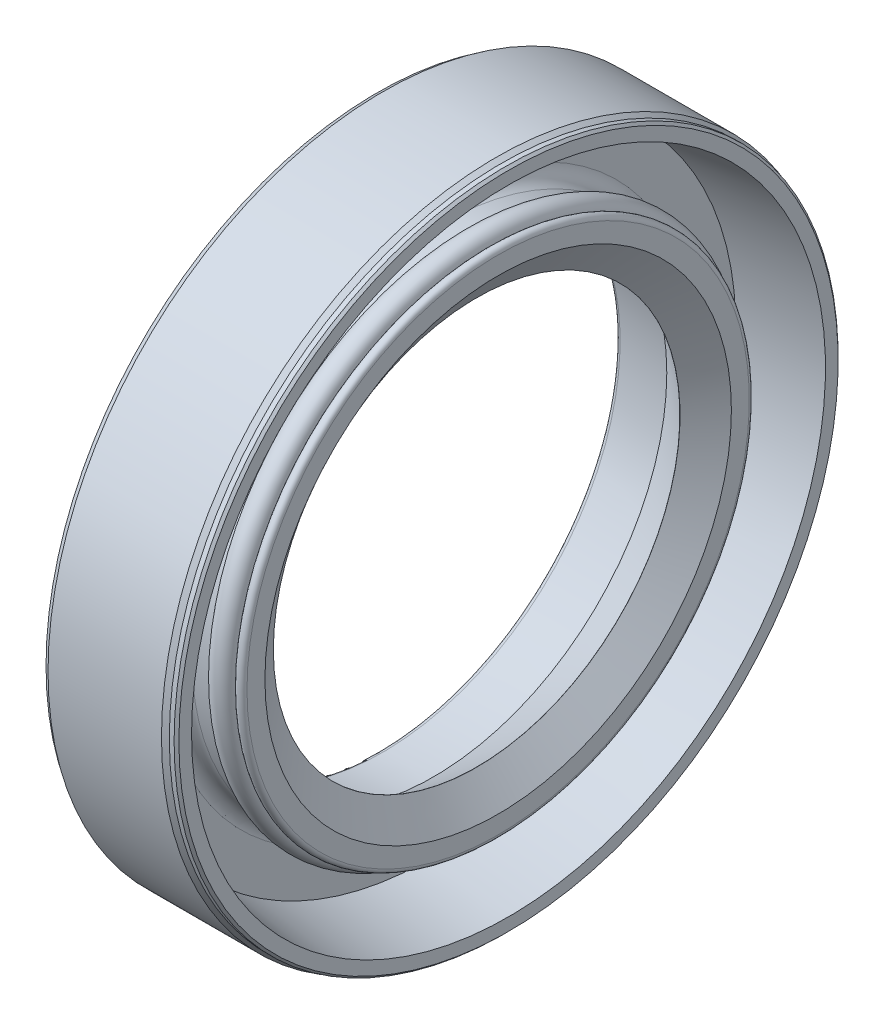
ISO-10303-21;
HEADER;
FILE_DESCRIPTION(('STEP AP214'),'2;1');
FILE_NAME('part.step','',(''),(''),'','','');
FILE_SCHEMA(('AUTOMOTIVE_DESIGN { 1 0 10303 214 1 1 1 1 }'));
ENDSEC;
DATA;
#1=APPLICATION_CONTEXT('core data for automotive mechanical design processes');
#2=APPLICATION_PROTOCOL_DEFINITION('international standard','automotive_design',2000,#1);
#3=PRODUCT_CONTEXT('',#1,'mechanical');
#4=PRODUCT('Part','Part','',(#3));
#5=PRODUCT_RELATED_PRODUCT_CATEGORY('part','',(#4));
#6=PRODUCT_DEFINITION_FORMATION('','',#4);
#7=PRODUCT_DEFINITION_CONTEXT('part definition',#1,'design');
#8=PRODUCT_DEFINITION('design','',#6,#7);
#9=PRODUCT_DEFINITION_SHAPE('','',#8);
#10=(LENGTH_UNIT() NAMED_UNIT(*) SI_UNIT(.MILLI.,.METRE.));
#11=(NAMED_UNIT(*) PLANE_ANGLE_UNIT() SI_UNIT($,.RADIAN.));
#12=(NAMED_UNIT(*) SI_UNIT($,.STERADIAN.) SOLID_ANGLE_UNIT());
#13=UNCERTAINTY_MEASURE_WITH_UNIT(LENGTH_MEASURE(1.E-05),#10,'distance_accuracy_value','');
#14=(GEOMETRIC_REPRESENTATION_CONTEXT(3) GLOBAL_UNCERTAINTY_ASSIGNED_CONTEXT((#13)) GLOBAL_UNIT_ASSIGNED_CONTEXT((#10,
#11,#12)) REPRESENTATION_CONTEXT('',''));
#15=CARTESIAN_POINT('',(0.,0.,0.));
#16=DIRECTION('',(0.,0.,1.));
#17=DIRECTION('',(1.,0.,0.));
#18=AXIS2_PLACEMENT_3D('',#15,#16,#17);
#19=CARTESIAN_POINT('',(0.0025000000000025,0.,0.));
#20=DIRECTION('',(-1.,0.,0.));
#21=DIRECTION('',(0.,0.,1.));
#22=AXIS2_PLACEMENT_3D('',#19,#20,#21);
#23=TOROIDAL_SURFACE('',#22,10.5,0.500000000000002);
#24=CARTESIAN_POINT('',(-0.497500000000001,0.,0.));
#25=DIRECTION('',(-1.,0.,0.));
#26=DIRECTION('',(0.,0.,1.));
#27=AXIS2_PLACEMENT_3D('',#24,#25,#26);
#28=CIRCLE('',#27,10.5);
#29=CARTESIAN_POINT('',(-0.497500000000001,0.,10.5));
#30=VERTEX_POINT('',#29);
#31=EDGE_CURVE('E10',#30,#30,#28,.T.);
#32=ORIENTED_EDGE('',*,*,#31,.F.);
#33=EDGE_LOOP('',(#32));
#34=FACE_BOUND('',#33,.T.);
#35=CARTESIAN_POINT('',(0.502500000000003,0.,0.));
#36=DIRECTION('',(-1.,0.,0.));
#37=DIRECTION('',(0.,0.,1.));
#38=AXIS2_PLACEMENT_3D('',#35,#36,#37);
#39=CIRCLE('',#38,10.5);
#40=CARTESIAN_POINT('',(0.502500000000003,0.,10.5));
#41=VERTEX_POINT('',#40);
#42=EDGE_CURVE('E106',#41,#41,#39,.T.);
#43=ORIENTED_EDGE('',*,*,#42,.T.);
#44=EDGE_LOOP('',(#43));
#45=FACE_BOUND('',#44,.T.);
#46=ADVANCED_FACE('F45',(#34,#45),#23,.T.);
#47=CARTESIAN_POINT('',(0.,0.,0.));
#48=DIRECTION('',(-1.,0.,0.));
#49=DIRECTION('',(0.,0.,1.));
#50=AXIS2_PLACEMENT_3D('',#47,#48,#49);
#51=CYLINDRICAL_SURFACE('',#50,10.5);
#52=CARTESIAN_POINT('',(-1.3975,0.,0.));
#53=DIRECTION('',(-1.,0.,0.));
#54=DIRECTION('',(0.,0.,1.));
#55=AXIS2_PLACEMENT_3D('',#52,#53,#54);
#56=CIRCLE('',#55,10.5);
#57=CARTESIAN_POINT('',(-1.3975,0.,10.5));
#58=VERTEX_POINT('',#57);
#59=EDGE_CURVE('E51',#58,#58,#56,.T.);
#60=ORIENTED_EDGE('',*,*,#59,.F.);
#61=EDGE_LOOP('',(#60));
#62=FACE_BOUND('',#61,.T.);
#63=ORIENTED_EDGE('',*,*,#31,.T.);
#64=EDGE_LOOP('',(#63));
#65=FACE_BOUND('',#64,.T.);
#66=ADVANCED_FACE('F209',(#62,#65),#51,.T.);
#67=CARTESIAN_POINT('',(-1.3975,0.,0.));
#68=DIRECTION('',(-1.,0.,0.));
#69=DIRECTION('',(0.,0.,1.));
#70=AXIS2_PLACEMENT_3D('',#67,#68,#69);
#71=TOROIDAL_SURFACE('',#70,11.1,0.600000000000002);
#72=CARTESIAN_POINT('',(-1.9975,0.,0.));
#73=DIRECTION('',(-1.,0.,0.));
#74=DIRECTION('',(0.,0.,1.));
#75=AXIS2_PLACEMENT_3D('',#72,#73,#74);
#76=CIRCLE('',#75,11.1);
#77=CARTESIAN_POINT('',(-1.9975,0.,11.1));
#78=VERTEX_POINT('',#77);
#79=EDGE_CURVE('E55',#78,#78,#76,.T.);
#80=ORIENTED_EDGE('',*,*,#79,.F.);
#81=EDGE_LOOP('',(#80));
#82=FACE_BOUND('',#81,.T.);
#83=ORIENTED_EDGE('',*,*,#59,.T.);
#84=EDGE_LOOP('',(#83));
#85=FACE_BOUND('',#84,.T.);
#86=ADVANCED_FACE('F204',(#82,#85),#71,.F.);
#87=CARTESIAN_POINT('',(-1.9975,12.8333333333333,0.));
#88=DIRECTION('',(-1.,0.,0.));
#89=DIRECTION('',(0.,0.,1.));
#90=AXIS2_PLACEMENT_3D('',#87,#88,#89);
#91=PLANE('',#90);
#92=CARTESIAN_POINT('',(-1.9975,0.,0.));
#93=DIRECTION('',(-1.,0.,0.));
#94=DIRECTION('',(0.,0.,1.));
#95=AXIS2_PLACEMENT_3D('',#92,#93,#94);
#96=CIRCLE('',#95,12.8333333333333);
#97=CARTESIAN_POINT('',(-1.9975,0.,12.8333333333333));
#98=VERTEX_POINT('',#97);
#99=EDGE_CURVE('E59',#98,#98,#96,.T.);
#100=ORIENTED_EDGE('',*,*,#99,.F.);
#101=EDGE_LOOP('',(#100));
#102=FACE_BOUND('',#101,.T.);
#103=ORIENTED_EDGE('',*,*,#79,.T.);
#104=EDGE_LOOP('',(#103));
#105=FACE_BOUND('',#104,.T.);
#106=ADVANCED_FACE('F198',(#102,#105),#91,.F.);
#107=CARTESIAN_POINT('',(-1.9975,0.,0.));
#108=DIRECTION('',(1.,0.,0.));
#109=DIRECTION('',(0.,0.,-1.));
#110=AXIS2_PLACEMENT_3D('',#107,#108,#109);
#111=CONICAL_SURFACE('',#110,12.8333333333333,0.124354994546765);
#112=CARTESIAN_POINT('',(1.33583333333333,0.,0.));
#113=DIRECTION('',(-1.,0.,0.));
#114=DIRECTION('',(0.,0.,1.));
#115=AXIS2_PLACEMENT_3D('',#112,#113,#114);
#116=CIRCLE('',#115,13.25);
#117=CARTESIAN_POINT('',(1.33583333333333,0.,13.25));
#118=VERTEX_POINT('',#117);
#119=EDGE_CURVE('E64',#118,#118,#116,.T.);
#120=ORIENTED_EDGE('',*,*,#119,.F.);
#121=EDGE_LOOP('',(#120));
#122=FACE_BOUND('',#121,.T.);
#123=ORIENTED_EDGE('',*,*,#99,.T.);
#124=EDGE_LOOP('',(#123));
#125=FACE_BOUND('',#124,.T.);
#126=ADVANCED_FACE('F192',(#122,#125),#111,.F.);
#127=CARTESIAN_POINT('',(1.33583333333333,13.78,0.));
#128=DIRECTION('',(-1.,0.,0.));
#129=DIRECTION('',(0.,0.,1.));
#130=AXIS2_PLACEMENT_3D('',#127,#128,#129);
#131=PLANE('',#130);
#132=CARTESIAN_POINT('',(1.33583333333333,0.,0.));
#133=DIRECTION('',(-1.,0.,0.));
#134=DIRECTION('',(0.,0.,1.));
#135=AXIS2_PLACEMENT_3D('',#132,#133,#134);
#136=CIRCLE('',#135,13.78);
#137=CARTESIAN_POINT('',(1.33583333333333,0.,13.78));
#138=VERTEX_POINT('',#137);
#139=EDGE_CURVE('E67',#138,#138,#136,.T.);
#140=ORIENTED_EDGE('',*,*,#139,.F.);
#141=EDGE_LOOP('',(#140));
#142=FACE_BOUND('',#141,.T.);
#143=ORIENTED_EDGE('',*,*,#119,.T.);
#144=EDGE_LOOP('',(#143));
#145=FACE_BOUND('',#144,.T.);
#146=ADVANCED_FACE('F186',(#142,#145),#131,.F.);
#147=CARTESIAN_POINT('',(1.33583333333333,0.,0.));
#148=DIRECTION('',(-1.,0.,0.));
#149=DIRECTION('',(0.,0.,1.));
#150=AXIS2_PLACEMENT_3D('',#147,#148,#149);
#151=CONICAL_SURFACE('',#150,13.78,0.785398163397445);
#152=CARTESIAN_POINT('',(1.23583333333333,0.,0.));
#153=DIRECTION('',(-1.,0.,0.));
#154=DIRECTION('',(0.,0.,1.));
#155=AXIS2_PLACEMENT_3D('',#152,#153,#154);
#156=CIRCLE('',#155,13.88);
#157=CARTESIAN_POINT('',(1.23583333333333,0.,13.88));
#158=VERTEX_POINT('',#157);
#159=EDGE_CURVE('E70',#158,#158,#156,.T.);
#160=ORIENTED_EDGE('',*,*,#159,.F.);
#161=EDGE_LOOP('',(#160));
#162=FACE_BOUND('',#161,.T.);
#163=ORIENTED_EDGE('',*,*,#139,.T.);
#164=EDGE_LOOP('',(#163));
#165=FACE_BOUND('',#164,.T.);
#166=ADVANCED_FACE('F180',(#162,#165),#151,.T.);
#167=CARTESIAN_POINT('',(0.,0.,0.));
#168=DIRECTION('',(-1.,0.,0.));
#169=DIRECTION('',(0.,0.,1.));
#170=AXIS2_PLACEMENT_3D('',#167,#168,#169);
#171=CYLINDRICAL_SURFACE('',#170,13.88);
#172=CARTESIAN_POINT('',(1.03583333333333,0.,0.));
#173=DIRECTION('',(-1.,0.,0.));
#174=DIRECTION('',(0.,0.,1.));
#175=AXIS2_PLACEMENT_3D('',#172,#173,#174);
#176=CIRCLE('',#175,13.88);
#177=CARTESIAN_POINT('',(1.03583333333333,0.,13.88));
#178=VERTEX_POINT('',#177);
#179=EDGE_CURVE('E73',#178,#178,#176,.T.);
#180=ORIENTED_EDGE('',*,*,#179,.F.);
#181=EDGE_LOOP('',(#180));
#182=FACE_BOUND('',#181,.T.);
#183=ORIENTED_EDGE('',*,*,#159,.T.);
#184=EDGE_LOOP('',(#183));
#185=FACE_BOUND('',#184,.T.);
#186=ADVANCED_FACE('F174',(#182,#185),#171,.T.);
#187=CARTESIAN_POINT('',(1.03583333333333,0.,0.));
#188=DIRECTION('',(-1.,0.,0.));
#189=DIRECTION('',(0.,0.,1.));
#190=AXIS2_PLACEMENT_3D('',#187,#188,#189);
#191=CONICAL_SURFACE('',#190,13.88,0.523598775598301);
#192=CARTESIAN_POINT('',(0.827987236425063,0.,0.));
#193=DIRECTION('',(-1.,0.,0.));
#194=DIRECTION('',(0.,0.,1.));
#195=AXIS2_PLACEMENT_3D('',#192,#193,#194);
#196=CIRCLE('',#195,14.);
#197=CARTESIAN_POINT('',(0.827987236425063,0.,14.));
#198=VERTEX_POINT('',#197);
#199=EDGE_CURVE('E76',#198,#198,#196,.T.);
#200=ORIENTED_EDGE('',*,*,#199,.F.);
#201=EDGE_LOOP('',(#200));
#202=FACE_BOUND('',#201,.T.);
#203=ORIENTED_EDGE('',*,*,#179,.T.);
#204=EDGE_LOOP('',(#203));
#205=FACE_BOUND('',#204,.T.);
#206=ADVANCED_FACE('F168',(#202,#205),#191,.T.);
#207=CARTESIAN_POINT('',(0.,0.,0.));
#208=DIRECTION('',(-1.,0.,0.));
#209=DIRECTION('',(0.,0.,1.));
#210=AXIS2_PLACEMENT_3D('',#207,#208,#209);
#211=CYLINDRICAL_SURFACE('',#210,14.);
#212=CARTESIAN_POINT('',(-3.91416666666671,0.,0.));
#213=DIRECTION('',(-1.,0.,0.));
#214=DIRECTION('',(0.,0.,1.));
#215=AXIS2_PLACEMENT_3D('',#212,#213,#214);
#216=CIRCLE('',#215,14.);
#217=CARTESIAN_POINT('',(-3.91416666666671,0.,14.));
#218=VERTEX_POINT('',#217);
#219=EDGE_CURVE('E79',#218,#218,#216,.T.);
#220=ORIENTED_EDGE('',*,*,#219,.F.);
#221=EDGE_LOOP('',(#220));
#222=FACE_BOUND('',#221,.T.);
#223=ORIENTED_EDGE('',*,*,#199,.T.);
#224=EDGE_LOOP('',(#223));
#225=FACE_BOUND('',#224,.T.);
#226=ADVANCED_FACE('F162',(#222,#225),#211,.T.);
#227=CARTESIAN_POINT('',(-3.91416666666671,0.,0.));
#228=DIRECTION('',(1.,0.,0.));
#229=DIRECTION('',(0.,0.,-1.));
#230=AXIS2_PLACEMENT_3D('',#227,#228,#229);
#231=CONICAL_SURFACE('',#230,14.,0.58800260354752);
#232=CARTESIAN_POINT('',(-4.16416666666667,0.,0.));
#233=DIRECTION('',(-1.,0.,0.));
#234=DIRECTION('',(0.,0.,1.));
#235=AXIS2_PLACEMENT_3D('',#232,#233,#234);
#236=CIRCLE('',#235,13.8333333333334);
#237=CARTESIAN_POINT('',(-4.16416666666667,0.,13.8333333333334));
#238=VERTEX_POINT('',#237);
#239=EDGE_CURVE('E82',#238,#238,#236,.T.);
#240=ORIENTED_EDGE('',*,*,#239,.F.);
#241=EDGE_LOOP('',(#240));
#242=FACE_BOUND('',#241,.T.);
#243=ORIENTED_EDGE('',*,*,#219,.T.);
#244=EDGE_LOOP('',(#243));
#245=FACE_BOUND('',#244,.T.);
#246=ADVANCED_FACE('F156',(#242,#245),#231,.T.);
#247=CARTESIAN_POINT('',(-4.16416666666667,13.8333333333334,0.));
#248=DIRECTION('',(1.,0.,0.));
#249=DIRECTION('',(0.,0.,-1.));
#250=AXIS2_PLACEMENT_3D('',#247,#248,#249);
#251=PLANE('',#250);
#252=CARTESIAN_POINT('',(-4.16416666666667,0.,0.));
#253=DIRECTION('',(-1.,0.,0.));
#254=DIRECTION('',(0.,0.,1.));
#255=AXIS2_PLACEMENT_3D('',#252,#253,#254);
#256=CIRCLE('',#255,10.1861392971824);
#257=CARTESIAN_POINT('',(-4.16416666666667,0.,10.1861392971824));
#258=VERTEX_POINT('',#257);
#259=EDGE_CURVE('E85',#258,#258,#256,.T.);
#260=ORIENTED_EDGE('',*,*,#259,.F.);
#261=EDGE_LOOP('',(#260));
#262=FACE_BOUND('',#261,.T.);
#263=ORIENTED_EDGE('',*,*,#239,.T.);
#264=EDGE_LOOP('',(#263));
#265=FACE_BOUND('',#264,.T.);
#266=ADVANCED_FACE('F150',(#262,#265),#251,.F.);
#267=CARTESIAN_POINT('',(-3.91416666666667,0.,0.));
#268=DIRECTION('',(-1.,0.,0.));
#269=DIRECTION('',(0.,0.,1.));
#270=AXIS2_PLACEMENT_3D('',#267,#268,#269);
#271=TOROIDAL_SURFACE('',#270,10.1861392971824,0.250000000000002);
#272=CARTESIAN_POINT('',(-3.93595560235359,0.,0.));
#273=DIRECTION('',(-1.,0.,0.));
#274=DIRECTION('',(0.,0.,1.));
#275=AXIS2_PLACEMENT_3D('',#272,#273,#274);
#276=CIRCLE('',#275,9.93709062265944);
#277=CARTESIAN_POINT('',(-3.93595560235359,0.,9.93709062265944));
#278=VERTEX_POINT('',#277);
#279=EDGE_CURVE('E88',#278,#278,#276,.T.);
#280=ORIENTED_EDGE('',*,*,#279,.F.);
#281=EDGE_LOOP('',(#280));
#282=FACE_BOUND('',#281,.T.);
#283=ORIENTED_EDGE('',*,*,#259,.T.);
#284=EDGE_LOOP('',(#283));
#285=FACE_BOUND('',#284,.T.);
#286=ADVANCED_FACE('F144',(#282,#285),#271,.T.);
#287=CARTESIAN_POINT('',(-3.93595560235359,0.,0.));
#288=DIRECTION('',(-1.,0.,0.));
#289=DIRECTION('',(0.,0.,1.));
#290=AXIS2_PLACEMENT_3D('',#287,#288,#289);
#291=CONICAL_SURFACE('',#290,9.93709062265944,0.0872664625997223);
#292=CARTESIAN_POINT('',(-1.7975,0.,0.));
#293=DIRECTION('',(-1.,0.,0.));
#294=DIRECTION('',(0.,0.,1.));
#295=AXIS2_PLACEMENT_3D('',#292,#293,#294);
#296=CIRCLE('',#295,9.74999999999999);
#297=CARTESIAN_POINT('',(-1.7975,0.,9.74999999999999));
#298=VERTEX_POINT('',#297);
#299=EDGE_CURVE('E91',#298,#298,#296,.T.);
#300=ORIENTED_EDGE('',*,*,#299,.F.);
#301=EDGE_LOOP('',(#300));
#302=FACE_BOUND('',#301,.T.);
#303=ORIENTED_EDGE('',*,*,#279,.T.);
#304=EDGE_LOOP('',(#303));
#305=FACE_BOUND('',#304,.T.);
#306=ADVANCED_FACE('F138',(#302,#305),#291,.F.);
#307=CARTESIAN_POINT('',(-1.7975,0.,0.));
#308=DIRECTION('',(-1.,0.,0.));
#309=DIRECTION('',(0.,0.,1.));
#310=AXIS2_PLACEMENT_3D('',#307,#308,#309);
#311=CONICAL_SURFACE('',#310,9.74999999999999,0.607638977001409);
#312=CARTESIAN_POINT('',(0.,0.,0.));
#313=DIRECTION('',(-1.,0.,0.));
#314=DIRECTION('',(0.,0.,1.));
#315=AXIS2_PLACEMENT_3D('',#312,#313,#314);
#316=CIRCLE('',#315,8.5);
#317=CARTESIAN_POINT('',(0.,0.,8.5));
#318=VERTEX_POINT('',#317);
#319=EDGE_CURVE('E94',#318,#318,#316,.T.);
#320=ORIENTED_EDGE('',*,*,#319,.F.);
#321=EDGE_LOOP('',(#320));
#322=FACE_BOUND('',#321,.T.);
#323=ORIENTED_EDGE('',*,*,#299,.T.);
#324=EDGE_LOOP('',(#323));
#325=FACE_BOUND('',#324,.T.);
#326=ADVANCED_FACE('F132',(#322,#325),#311,.F.);
#327=CARTESIAN_POINT('',(0.,0.,0.));
#328=DIRECTION('',(-1.,0.,0.));
#329=DIRECTION('',(0.,0.,1.));
#330=AXIS2_PLACEMENT_3D('',#327,#328,#329);
#331=CYLINDRICAL_SURFACE('',#330,8.5);
#332=CARTESIAN_POINT('',(0.00499999999999806,0.,0.));
#333=DIRECTION('',(-1.,0.,0.));
#334=DIRECTION('',(0.,0.,1.));
#335=AXIS2_PLACEMENT_3D('',#332,#333,#334);
#336=CIRCLE('',#335,8.5);
#337=CARTESIAN_POINT('',(0.00499999999999806,0.,8.5));
#338=VERTEX_POINT('',#337);
#339=EDGE_CURVE('E97',#338,#338,#336,.T.);
#340=ORIENTED_EDGE('',*,*,#339,.F.);
#341=EDGE_LOOP('',(#340));
#342=FACE_BOUND('',#341,.T.);
#343=ORIENTED_EDGE('',*,*,#319,.T.);
#344=EDGE_LOOP('',(#343));
#345=FACE_BOUND('',#344,.T.);
#346=ADVANCED_FACE('F126',(#342,#345),#331,.F.);
#347=CARTESIAN_POINT('',(0.00499999999999806,0.,0.));
#348=DIRECTION('',(1.,0.,0.));
#349=DIRECTION('',(0.,0.,-1.));
#350=AXIS2_PLACEMENT_3D('',#347,#348,#349);
#351=CONICAL_SURFACE('',#350,8.5,0.948091699380555);
#352=CARTESIAN_POINT('',(0.902500000000001,0.,0.));
#353=DIRECTION('',(-1.,0.,0.));
#354=DIRECTION('',(0.,0.,1.));
#355=AXIS2_PLACEMENT_3D('',#352,#353,#354);
#356=CIRCLE('',#355,9.74999999999999);
#357=CARTESIAN_POINT('',(0.902500000000001,0.,9.74999999999999));
#358=VERTEX_POINT('',#357);
#359=EDGE_CURVE('E100',#358,#358,#356,.T.);
#360=ORIENTED_EDGE('',*,*,#359,.F.);
#361=EDGE_LOOP('',(#360));
#362=FACE_BOUND('',#361,.T.);
#363=ORIENTED_EDGE('',*,*,#339,.T.);
#364=EDGE_LOOP('',(#363));
#365=FACE_BOUND('',#364,.T.);
#366=ADVANCED_FACE('F120',(#362,#365),#351,.F.);
#367=CARTESIAN_POINT('',(0.902500000000001,10.5,0.));
#368=DIRECTION('',(-1.,0.,0.));
#369=DIRECTION('',(0.,0.,1.));
#370=AXIS2_PLACEMENT_3D('',#367,#368,#369);
#371=PLANE('',#370);
#372=CARTESIAN_POINT('',(0.902500000000001,0.,0.));
#373=DIRECTION('',(-1.,0.,0.));
#374=DIRECTION('',(0.,0.,1.));
#375=AXIS2_PLACEMENT_3D('',#372,#373,#374);
#376=CIRCLE('',#375,10.5);
#377=CARTESIAN_POINT('',(0.902500000000001,0.,10.5));
#378=VERTEX_POINT('',#377);
#379=EDGE_CURVE('E103',#378,#378,#376,.T.);
#380=ORIENTED_EDGE('',*,*,#379,.F.);
#381=EDGE_LOOP('',(#380));
#382=FACE_BOUND('',#381,.T.);
#383=ORIENTED_EDGE('',*,*,#359,.T.);
#384=EDGE_LOOP('',(#383));
#385=FACE_BOUND('',#384,.T.);
#386=ADVANCED_FACE('F114',(#382,#385),#371,.F.);
#387=CARTESIAN_POINT('',(0.702500000000002,0.,0.));
#388=DIRECTION('',(-1.,0.,0.));
#389=DIRECTION('',(0.,0.,1.));
#390=AXIS2_PLACEMENT_3D('',#387,#388,#389);
#391=TOROIDAL_SURFACE('',#390,10.5,0.199999999999999);
#392=ORIENTED_EDGE('',*,*,#42,.F.);
#393=EDGE_LOOP('',(#392));
#394=FACE_BOUND('',#393,.T.);
#395=ORIENTED_EDGE('',*,*,#379,.T.);
#396=EDGE_LOOP('',(#395));
#397=FACE_BOUND('',#396,.T.);
#398=ADVANCED_FACE('F111',(#394,#397),#391,.T.);
#399=CLOSED_SHELL('',(#46,#66,#86,#106,#126,#146,#166,#186,#206,#226,#246,#266,#286,#306,#326,
#346,#366,#386,#398));
#400=MANIFOLD_SOLID_BREP('B2',#399);
#401=ADVANCED_BREP_SHAPE_REPRESENTATION('',(#18,#400),#14);
#402=SHAPE_DEFINITION_REPRESENTATION(#9,#401);
ENDSEC;
END-ISO-10303-21;
